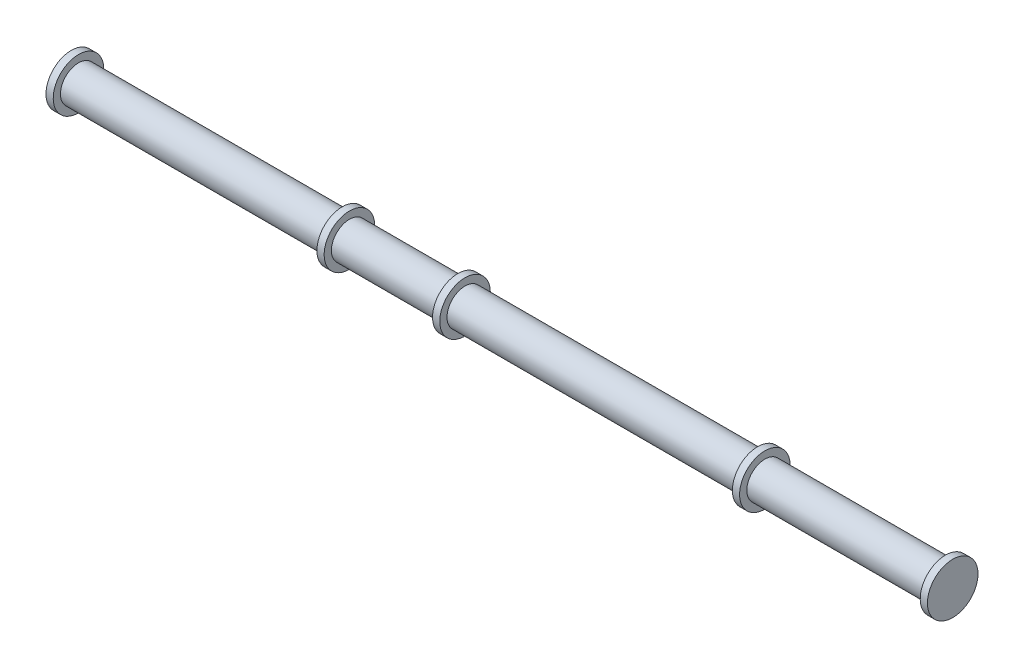
ISO-10303-21;
HEADER;
FILE_DESCRIPTION(('STEP AP214'),'2;1');
FILE_NAME('part.step','',(''),(''),'','','');
FILE_SCHEMA(('AUTOMOTIVE_DESIGN { 1 0 10303 214 1 1 1 1 }'));
ENDSEC;
DATA;
#1=APPLICATION_CONTEXT('core data for automotive mechanical design processes');
#2=APPLICATION_PROTOCOL_DEFINITION('international standard','automotive_design',2000,#1);
#3=PRODUCT_CONTEXT('',#1,'mechanical');
#4=PRODUCT('Part','Part','',(#3));
#5=PRODUCT_RELATED_PRODUCT_CATEGORY('part','',(#4));
#6=PRODUCT_DEFINITION_FORMATION('','',#4);
#7=PRODUCT_DEFINITION_CONTEXT('part definition',#1,'design');
#8=PRODUCT_DEFINITION('design','',#6,#7);
#9=PRODUCT_DEFINITION_SHAPE('','',#8);
#10=(LENGTH_UNIT() NAMED_UNIT(*) SI_UNIT(.MILLI.,.METRE.));
#11=(NAMED_UNIT(*) PLANE_ANGLE_UNIT() SI_UNIT($,.RADIAN.));
#12=(NAMED_UNIT(*) SI_UNIT($,.STERADIAN.) SOLID_ANGLE_UNIT());
#13=UNCERTAINTY_MEASURE_WITH_UNIT(LENGTH_MEASURE(1.E-05),#10,'distance_accuracy_value','');
#14=(GEOMETRIC_REPRESENTATION_CONTEXT(3) GLOBAL_UNCERTAINTY_ASSIGNED_CONTEXT((#13)) GLOBAL_UNIT_ASSIGNED_CONTEXT((#10,
#11,#12)) REPRESENTATION_CONTEXT('',''));
#15=CARTESIAN_POINT('',(0.,0.,0.));
#16=DIRECTION('',(0.,0.,1.));
#17=DIRECTION('',(1.,0.,0.));
#18=AXIS2_PLACEMENT_3D('',#15,#16,#17);
#19=CARTESIAN_POINT('',(0.,0.,0.));
#20=DIRECTION('',(1.,0.,0.));
#21=DIRECTION('',(0.,1.,0.));
#22=AXIS2_PLACEMENT_3D('',#19,#20,#21);
#23=PLANE('',#22);
#24=CARTESIAN_POINT('',(0.,0.,0.));
#25=DIRECTION('',(1.,0.,0.));
#26=DIRECTION('',(0.,1.,0.));
#27=AXIS2_PLACEMENT_3D('',#24,#25,#26);
#28=CIRCLE('',#27,7.);
#29=CARTESIAN_POINT('',(0.,7.,0.));
#30=VERTEX_POINT('',#29);
#31=EDGE_CURVE('E10',#30,#30,#28,.T.);
#32=ORIENTED_EDGE('',*,*,#31,.F.);
#33=EDGE_LOOP('',(#32));
#34=FACE_BOUND('',#33,.T.);
#35=ADVANCED_FACE('F35',(#34),#23,.F.);
#36=CARTESIAN_POINT('',(244.,0.,0.));
#37=DIRECTION('',(1.,0.,0.));
#38=DIRECTION('',(0.,1.,0.));
#39=AXIS2_PLACEMENT_3D('',#36,#37,#38);
#40=CYLINDRICAL_SURFACE('',#39,7.);
#41=CARTESIAN_POINT('',(2.,0.,0.));
#42=DIRECTION('',(1.,0.,0.));
#43=DIRECTION('',(0.,1.,0.));
#44=AXIS2_PLACEMENT_3D('',#41,#42,#43);
#45=CIRCLE('',#44,7.);
#46=CARTESIAN_POINT('',(2.,7.,0.));
#47=VERTEX_POINT('',#46);
#48=EDGE_CURVE('E41',#47,#47,#45,.T.);
#49=ORIENTED_EDGE('',*,*,#48,.F.);
#50=EDGE_LOOP('',(#49));
#51=FACE_BOUND('',#50,.T.);
#52=ORIENTED_EDGE('',*,*,#31,.T.);
#53=EDGE_LOOP('',(#52));
#54=FACE_BOUND('',#53,.T.);
#55=ADVANCED_FACE('F191',(#51,#54),#40,.T.);
#56=CARTESIAN_POINT('',(2.,7.,0.));
#57=DIRECTION('',(-1.,0.,0.));
#58=DIRECTION('',(0.,-1.,0.));
#59=AXIS2_PLACEMENT_3D('',#56,#57,#58);
#60=PLANE('',#59);
#61=CARTESIAN_POINT('',(2.,0.,0.));
#62=DIRECTION('',(1.,0.,0.));
#63=DIRECTION('',(0.,1.,0.));
#64=AXIS2_PLACEMENT_3D('',#61,#62,#63);
#65=CIRCLE('',#64,5.);
#66=CARTESIAN_POINT('',(2.,5.,0.));
#67=VERTEX_POINT('',#66);
#68=EDGE_CURVE('E45',#67,#67,#65,.T.);
#69=ORIENTED_EDGE('',*,*,#68,.F.);
#70=EDGE_LOOP('',(#69));
#71=FACE_BOUND('',#70,.T.);
#72=ORIENTED_EDGE('',*,*,#48,.T.);
#73=EDGE_LOOP('',(#72));
#74=FACE_BOUND('',#73,.T.);
#75=ADVANCED_FACE('F186',(#71,#74),#60,.F.);
#76=CARTESIAN_POINT('',(244.,0.,0.));
#77=DIRECTION('',(1.,0.,0.));
#78=DIRECTION('',(0.,1.,0.));
#79=AXIS2_PLACEMENT_3D('',#76,#77,#78);
#80=CYLINDRICAL_SURFACE('',#79,5.);
#81=CARTESIAN_POINT('',(75.,0.,0.));
#82=DIRECTION('',(1.,0.,0.));
#83=DIRECTION('',(0.,1.,0.));
#84=AXIS2_PLACEMENT_3D('',#81,#82,#83);
#85=CIRCLE('',#84,5.);
#86=CARTESIAN_POINT('',(75.,5.,0.));
#87=VERTEX_POINT('',#86);
#88=EDGE_CURVE('E49',#87,#87,#85,.T.);
#89=ORIENTED_EDGE('',*,*,#88,.F.);
#90=EDGE_LOOP('',(#89));
#91=FACE_BOUND('',#90,.T.);
#92=ORIENTED_EDGE('',*,*,#68,.T.);
#93=EDGE_LOOP('',(#92));
#94=FACE_BOUND('',#93,.T.);
#95=ADVANCED_FACE('F180',(#91,#94),#80,.T.);
#96=CARTESIAN_POINT('',(75.,5.,0.));
#97=DIRECTION('',(1.,0.,0.));
#98=DIRECTION('',(0.,1.,0.));
#99=AXIS2_PLACEMENT_3D('',#96,#97,#98);
#100=PLANE('',#99);
#101=CARTESIAN_POINT('',(75.,0.,0.));
#102=DIRECTION('',(1.,0.,0.));
#103=DIRECTION('',(0.,1.,0.));
#104=AXIS2_PLACEMENT_3D('',#101,#102,#103);
#105=CIRCLE('',#104,7.);
#106=CARTESIAN_POINT('',(75.,7.,0.));
#107=VERTEX_POINT('',#106);
#108=EDGE_CURVE('E54',#107,#107,#105,.T.);
#109=ORIENTED_EDGE('',*,*,#108,.F.);
#110=EDGE_LOOP('',(#109));
#111=FACE_BOUND('',#110,.T.);
#112=ORIENTED_EDGE('',*,*,#88,.T.);
#113=EDGE_LOOP('',(#112));
#114=FACE_BOUND('',#113,.T.);
#115=ADVANCED_FACE('F174',(#111,#114),#100,.F.);
#116=CARTESIAN_POINT('',(244.,0.,0.));
#117=DIRECTION('',(1.,0.,0.));
#118=DIRECTION('',(0.,1.,0.));
#119=AXIS2_PLACEMENT_3D('',#116,#117,#118);
#120=CYLINDRICAL_SURFACE('',#119,7.);
#121=CARTESIAN_POINT('',(77.,0.,0.));
#122=DIRECTION('',(1.,0.,0.));
#123=DIRECTION('',(0.,1.,0.));
#124=AXIS2_PLACEMENT_3D('',#121,#122,#123);
#125=CIRCLE('',#124,7.);
#126=CARTESIAN_POINT('',(77.,7.,0.));
#127=VERTEX_POINT('',#126);
#128=EDGE_CURVE('E57',#127,#127,#125,.T.);
#129=ORIENTED_EDGE('',*,*,#128,.F.);
#130=EDGE_LOOP('',(#129));
#131=FACE_BOUND('',#130,.T.);
#132=ORIENTED_EDGE('',*,*,#108,.T.);
#133=EDGE_LOOP('',(#132));
#134=FACE_BOUND('',#133,.T.);
#135=ADVANCED_FACE('F168',(#131,#134),#120,.T.);
#136=CARTESIAN_POINT('',(77.,7.,0.));
#137=DIRECTION('',(-1.,0.,0.));
#138=DIRECTION('',(0.,-1.,0.));
#139=AXIS2_PLACEMENT_3D('',#136,#137,#138);
#140=PLANE('',#139);
#141=CARTESIAN_POINT('',(77.,0.,0.));
#142=DIRECTION('',(1.,0.,0.));
#143=DIRECTION('',(0.,1.,0.));
#144=AXIS2_PLACEMENT_3D('',#141,#142,#143);
#145=CIRCLE('',#144,5.);
#146=CARTESIAN_POINT('',(77.,5.,0.));
#147=VERTEX_POINT('',#146);
#148=EDGE_CURVE('E60',#147,#147,#145,.T.);
#149=ORIENTED_EDGE('',*,*,#148,.F.);
#150=EDGE_LOOP('',(#149));
#151=FACE_BOUND('',#150,.T.);
#152=ORIENTED_EDGE('',*,*,#128,.T.);
#153=EDGE_LOOP('',(#152));
#154=FACE_BOUND('',#153,.T.);
#155=ADVANCED_FACE('F162',(#151,#154),#140,.F.);
#156=CARTESIAN_POINT('',(244.,0.,0.));
#157=DIRECTION('',(1.,0.,0.));
#158=DIRECTION('',(0.,1.,0.));
#159=AXIS2_PLACEMENT_3D('',#156,#157,#158);
#160=CYLINDRICAL_SURFACE('',#159,5.);
#161=CARTESIAN_POINT('',(107.,0.,0.));
#162=DIRECTION('',(1.,0.,0.));
#163=DIRECTION('',(0.,1.,0.));
#164=AXIS2_PLACEMENT_3D('',#161,#162,#163);
#165=CIRCLE('',#164,5.);
#166=CARTESIAN_POINT('',(107.,5.,0.));
#167=VERTEX_POINT('',#166);
#168=EDGE_CURVE('E63',#167,#167,#165,.T.);
#169=ORIENTED_EDGE('',*,*,#168,.F.);
#170=EDGE_LOOP('',(#169));
#171=FACE_BOUND('',#170,.T.);
#172=ORIENTED_EDGE('',*,*,#148,.T.);
#173=EDGE_LOOP('',(#172));
#174=FACE_BOUND('',#173,.T.);
#175=ADVANCED_FACE('F156',(#171,#174),#160,.T.);
#176=CARTESIAN_POINT('',(107.,5.,0.));
#177=DIRECTION('',(1.,0.,0.));
#178=DIRECTION('',(0.,1.,0.));
#179=AXIS2_PLACEMENT_3D('',#176,#177,#178);
#180=PLANE('',#179);
#181=CARTESIAN_POINT('',(107.,0.,0.));
#182=DIRECTION('',(1.,0.,0.));
#183=DIRECTION('',(0.,1.,0.));
#184=AXIS2_PLACEMENT_3D('',#181,#182,#183);
#185=CIRCLE('',#184,7.);
#186=CARTESIAN_POINT('',(107.,7.,0.));
#187=VERTEX_POINT('',#186);
#188=EDGE_CURVE('E66',#187,#187,#185,.T.);
#189=ORIENTED_EDGE('',*,*,#188,.F.);
#190=EDGE_LOOP('',(#189));
#191=FACE_BOUND('',#190,.T.);
#192=ORIENTED_EDGE('',*,*,#168,.T.);
#193=EDGE_LOOP('',(#192));
#194=FACE_BOUND('',#193,.T.);
#195=ADVANCED_FACE('F150',(#191,#194),#180,.F.);
#196=CARTESIAN_POINT('',(244.,0.,0.));
#197=DIRECTION('',(1.,0.,0.));
#198=DIRECTION('',(0.,1.,0.));
#199=AXIS2_PLACEMENT_3D('',#196,#197,#198);
#200=CYLINDRICAL_SURFACE('',#199,7.);
#201=CARTESIAN_POINT('',(109.,0.,0.));
#202=DIRECTION('',(1.,0.,0.));
#203=DIRECTION('',(0.,1.,0.));
#204=AXIS2_PLACEMENT_3D('',#201,#202,#203);
#205=CIRCLE('',#204,7.);
#206=CARTESIAN_POINT('',(109.,7.,0.));
#207=VERTEX_POINT('',#206);
#208=EDGE_CURVE('E69',#207,#207,#205,.T.);
#209=ORIENTED_EDGE('',*,*,#208,.F.);
#210=EDGE_LOOP('',(#209));
#211=FACE_BOUND('',#210,.T.);
#212=ORIENTED_EDGE('',*,*,#188,.T.);
#213=EDGE_LOOP('',(#212));
#214=FACE_BOUND('',#213,.T.);
#215=ADVANCED_FACE('F144',(#211,#214),#200,.T.);
#216=CARTESIAN_POINT('',(109.,7.,0.));
#217=DIRECTION('',(-1.,0.,0.));
#218=DIRECTION('',(0.,-1.,0.));
#219=AXIS2_PLACEMENT_3D('',#216,#217,#218);
#220=PLANE('',#219);
#221=CARTESIAN_POINT('',(109.,0.,0.));
#222=DIRECTION('',(1.,0.,0.));
#223=DIRECTION('',(0.,1.,0.));
#224=AXIS2_PLACEMENT_3D('',#221,#222,#223);
#225=CIRCLE('',#224,5.);
#226=CARTESIAN_POINT('',(109.,5.,0.));
#227=VERTEX_POINT('',#226);
#228=EDGE_CURVE('E72',#227,#227,#225,.T.);
#229=ORIENTED_EDGE('',*,*,#228,.F.);
#230=EDGE_LOOP('',(#229));
#231=FACE_BOUND('',#230,.T.);
#232=ORIENTED_EDGE('',*,*,#208,.T.);
#233=EDGE_LOOP('',(#232));
#234=FACE_BOUND('',#233,.T.);
#235=ADVANCED_FACE('F138',(#231,#234),#220,.F.);
#236=CARTESIAN_POINT('',(244.,0.,0.));
#237=DIRECTION('',(1.,0.,0.));
#238=DIRECTION('',(0.,1.,0.));
#239=AXIS2_PLACEMENT_3D('',#236,#237,#238);
#240=CYLINDRICAL_SURFACE('',#239,5.);
#241=CARTESIAN_POINT('',(190.,0.,0.));
#242=DIRECTION('',(1.,0.,0.));
#243=DIRECTION('',(0.,1.,0.));
#244=AXIS2_PLACEMENT_3D('',#241,#242,#243);
#245=CIRCLE('',#244,5.);
#246=CARTESIAN_POINT('',(190.,5.,0.));
#247=VERTEX_POINT('',#246);
#248=EDGE_CURVE('E75',#247,#247,#245,.T.);
#249=ORIENTED_EDGE('',*,*,#248,.F.);
#250=EDGE_LOOP('',(#249));
#251=FACE_BOUND('',#250,.T.);
#252=ORIENTED_EDGE('',*,*,#228,.T.);
#253=EDGE_LOOP('',(#252));
#254=FACE_BOUND('',#253,.T.);
#255=ADVANCED_FACE('F132',(#251,#254),#240,.T.);
#256=CARTESIAN_POINT('',(190.,5.,0.));
#257=DIRECTION('',(1.,0.,0.));
#258=DIRECTION('',(0.,1.,0.));
#259=AXIS2_PLACEMENT_3D('',#256,#257,#258);
#260=PLANE('',#259);
#261=CARTESIAN_POINT('',(190.,0.,0.));
#262=DIRECTION('',(1.,0.,0.));
#263=DIRECTION('',(0.,1.,0.));
#264=AXIS2_PLACEMENT_3D('',#261,#262,#263);
#265=CIRCLE('',#264,7.);
#266=CARTESIAN_POINT('',(190.,7.,0.));
#267=VERTEX_POINT('',#266);
#268=EDGE_CURVE('E78',#267,#267,#265,.T.);
#269=ORIENTED_EDGE('',*,*,#268,.F.);
#270=EDGE_LOOP('',(#269));
#271=FACE_BOUND('',#270,.T.);
#272=ORIENTED_EDGE('',*,*,#248,.T.);
#273=EDGE_LOOP('',(#272));
#274=FACE_BOUND('',#273,.T.);
#275=ADVANCED_FACE('F126',(#271,#274),#260,.F.);
#276=CARTESIAN_POINT('',(244.,0.,0.));
#277=DIRECTION('',(1.,0.,0.));
#278=DIRECTION('',(0.,1.,0.));
#279=AXIS2_PLACEMENT_3D('',#276,#277,#278);
#280=CYLINDRICAL_SURFACE('',#279,7.);
#281=CARTESIAN_POINT('',(192.,0.,0.));
#282=DIRECTION('',(1.,0.,0.));
#283=DIRECTION('',(0.,1.,0.));
#284=AXIS2_PLACEMENT_3D('',#281,#282,#283);
#285=CIRCLE('',#284,7.);
#286=CARTESIAN_POINT('',(192.,7.,0.));
#287=VERTEX_POINT('',#286);
#288=EDGE_CURVE('E81',#287,#287,#285,.T.);
#289=ORIENTED_EDGE('',*,*,#288,.F.);
#290=EDGE_LOOP('',(#289));
#291=FACE_BOUND('',#290,.T.);
#292=ORIENTED_EDGE('',*,*,#268,.T.);
#293=EDGE_LOOP('',(#292));
#294=FACE_BOUND('',#293,.T.);
#295=ADVANCED_FACE('F120',(#291,#294),#280,.T.);
#296=CARTESIAN_POINT('',(192.,7.,0.));
#297=DIRECTION('',(-1.,0.,0.));
#298=DIRECTION('',(0.,-1.,0.));
#299=AXIS2_PLACEMENT_3D('',#296,#297,#298);
#300=PLANE('',#299);
#301=CARTESIAN_POINT('',(192.,0.,0.));
#302=DIRECTION('',(1.,0.,0.));
#303=DIRECTION('',(0.,1.,0.));
#304=AXIS2_PLACEMENT_3D('',#301,#302,#303);
#305=CIRCLE('',#304,5.);
#306=CARTESIAN_POINT('',(192.,5.,0.));
#307=VERTEX_POINT('',#306);
#308=EDGE_CURVE('E84',#307,#307,#305,.T.);
#309=ORIENTED_EDGE('',*,*,#308,.F.);
#310=EDGE_LOOP('',(#309));
#311=FACE_BOUND('',#310,.T.);
#312=ORIENTED_EDGE('',*,*,#288,.T.);
#313=EDGE_LOOP('',(#312));
#314=FACE_BOUND('',#313,.T.);
#315=ADVANCED_FACE('F114',(#311,#314),#300,.F.);
#316=CARTESIAN_POINT('',(244.,0.,0.));
#317=DIRECTION('',(1.,0.,0.));
#318=DIRECTION('',(0.,1.,0.));
#319=AXIS2_PLACEMENT_3D('',#316,#317,#318);
#320=CYLINDRICAL_SURFACE('',#319,5.);
#321=CARTESIAN_POINT('',(242.,0.,0.));
#322=DIRECTION('',(1.,0.,0.));
#323=DIRECTION('',(0.,1.,0.));
#324=AXIS2_PLACEMENT_3D('',#321,#322,#323);
#325=CIRCLE('',#324,5.);
#326=CARTESIAN_POINT('',(242.,5.,0.));
#327=VERTEX_POINT('',#326);
#328=EDGE_CURVE('E87',#327,#327,#325,.T.);
#329=ORIENTED_EDGE('',*,*,#328,.F.);
#330=EDGE_LOOP('',(#329));
#331=FACE_BOUND('',#330,.T.);
#332=ORIENTED_EDGE('',*,*,#308,.T.);
#333=EDGE_LOOP('',(#332));
#334=FACE_BOUND('',#333,.T.);
#335=ADVANCED_FACE('F108',(#331,#334),#320,.T.);
#336=CARTESIAN_POINT('',(242.,5.,0.));
#337=DIRECTION('',(1.,0.,0.));
#338=DIRECTION('',(0.,1.,0.));
#339=AXIS2_PLACEMENT_3D('',#336,#337,#338);
#340=PLANE('',#339);
#341=CARTESIAN_POINT('',(242.,0.,0.));
#342=DIRECTION('',(1.,0.,0.));
#343=DIRECTION('',(0.,1.,0.));
#344=AXIS2_PLACEMENT_3D('',#341,#342,#343);
#345=CIRCLE('',#344,7.);
#346=CARTESIAN_POINT('',(242.,7.,0.));
#347=VERTEX_POINT('',#346);
#348=EDGE_CURVE('E90',#347,#347,#345,.T.);
#349=ORIENTED_EDGE('',*,*,#348,.F.);
#350=EDGE_LOOP('',(#349));
#351=FACE_BOUND('',#350,.T.);
#352=ORIENTED_EDGE('',*,*,#328,.T.);
#353=EDGE_LOOP('',(#352));
#354=FACE_BOUND('',#353,.T.);
#355=ADVANCED_FACE('F102',(#351,#354),#340,.F.);
#356=CARTESIAN_POINT('',(244.,0.,0.));
#357=DIRECTION('',(1.,0.,0.));
#358=DIRECTION('',(0.,1.,0.));
#359=AXIS2_PLACEMENT_3D('',#356,#357,#358);
#360=CYLINDRICAL_SURFACE('',#359,7.);
#361=CARTESIAN_POINT('',(244.,0.,0.));
#362=DIRECTION('',(1.,0.,0.));
#363=DIRECTION('',(0.,1.,0.));
#364=AXIS2_PLACEMENT_3D('',#361,#362,#363);
#365=CIRCLE('',#364,7.);
#366=CARTESIAN_POINT('',(244.,7.,0.));
#367=VERTEX_POINT('',#366);
#368=EDGE_CURVE('E93',#367,#367,#365,.T.);
#369=ORIENTED_EDGE('',*,*,#368,.F.);
#370=EDGE_LOOP('',(#369));
#371=FACE_BOUND('',#370,.T.);
#372=ORIENTED_EDGE('',*,*,#348,.T.);
#373=EDGE_LOOP('',(#372));
#374=FACE_BOUND('',#373,.T.);
#375=ADVANCED_FACE('F99',(#371,#374),#360,.T.);
#376=CARTESIAN_POINT('',(244.,7.,0.));
#377=DIRECTION('',(-1.,0.,0.));
#378=DIRECTION('',(0.,-1.,0.));
#379=AXIS2_PLACEMENT_3D('',#376,#377,#378);
#380=PLANE('',#379);
#381=ORIENTED_EDGE('',*,*,#368,.T.);
#382=EDGE_LOOP('',(#381));
#383=FACE_BOUND('',#382,.T.);
#384=ADVANCED_FACE('F97',(#383),#380,.F.);
#385=CLOSED_SHELL('',(#35,#55,#75,#95,#115,#135,#155,#175,#195,#215,#235,#255,#275,#295,#315,
#335,#355,#375,#384));
#386=MANIFOLD_SOLID_BREP('B2',#385);
#387=ADVANCED_BREP_SHAPE_REPRESENTATION('',(#18,#386),#14);
#388=SHAPE_DEFINITION_REPRESENTATION(#9,#387);
ENDSEC;
END-ISO-10303-21;
